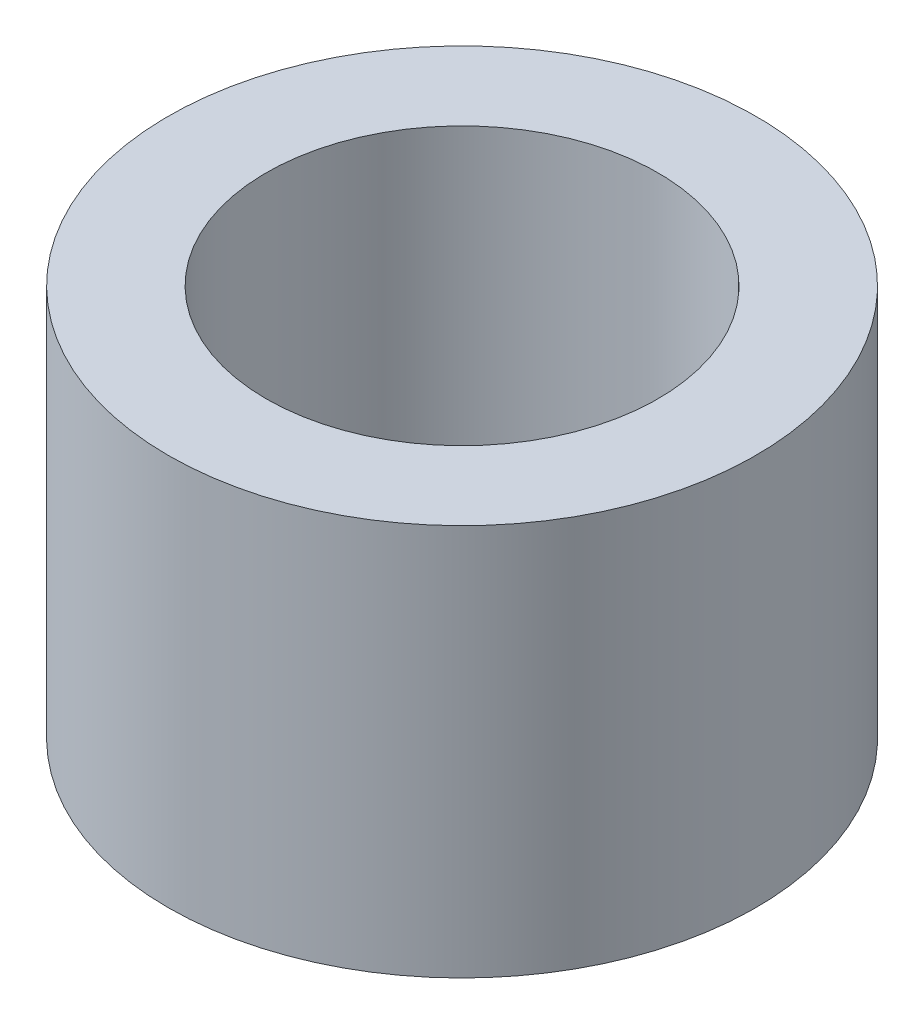
ISO-10303-21;
HEADER;
FILE_DESCRIPTION(('STEP AP214'),'2;1');
FILE_NAME('part.step','',(''),(''),'','','');
FILE_SCHEMA(('AUTOMOTIVE_DESIGN { 1 0 10303 214 1 1 1 1 }'));
ENDSEC;
DATA;
#1=APPLICATION_CONTEXT('core data for automotive mechanical design processes');
#2=APPLICATION_PROTOCOL_DEFINITION('international standard','automotive_design',2000,#1);
#3=PRODUCT_CONTEXT('',#1,'mechanical');
#4=PRODUCT('Part','Part','',(#3));
#5=PRODUCT_RELATED_PRODUCT_CATEGORY('part','',(#4));
#6=PRODUCT_DEFINITION_FORMATION('','',#4);
#7=PRODUCT_DEFINITION_CONTEXT('part definition',#1,'design');
#8=PRODUCT_DEFINITION('design','',#6,#7);
#9=PRODUCT_DEFINITION_SHAPE('','',#8);
#10=(LENGTH_UNIT() NAMED_UNIT(*) SI_UNIT(.MILLI.,.METRE.));
#11=(NAMED_UNIT(*) PLANE_ANGLE_UNIT() SI_UNIT($,.RADIAN.));
#12=(NAMED_UNIT(*) SI_UNIT($,.STERADIAN.) SOLID_ANGLE_UNIT());
#13=UNCERTAINTY_MEASURE_WITH_UNIT(LENGTH_MEASURE(1.E-05),#10,'distance_accuracy_value','');
#14=(GEOMETRIC_REPRESENTATION_CONTEXT(3) GLOBAL_UNCERTAINTY_ASSIGNED_CONTEXT((#13)) GLOBAL_UNIT_ASSIGNED_CONTEXT((#10,
#11,#12)) REPRESENTATION_CONTEXT('',''));
#15=CARTESIAN_POINT('',(0.,0.,0.));
#16=DIRECTION('',(0.,0.,1.));
#17=DIRECTION('',(1.,0.,0.));
#18=AXIS2_PLACEMENT_3D('',#15,#16,#17);
#19=CARTESIAN_POINT('',(0.,3.2,0.));
#20=DIRECTION('',(0.,1.,0.));
#21=DIRECTION('',(0.,0.,1.));
#22=AXIS2_PLACEMENT_3D('',#19,#20,#21);
#23=PLANE('',#22);
#24=CARTESIAN_POINT('',(0.,3.2,0.));
#25=DIRECTION('',(0.,1.,0.));
#26=DIRECTION('',(0.,0.,1.));
#27=AXIS2_PLACEMENT_3D('',#24,#25,#26);
#28=CIRCLE('',#27,2.4);
#29=CARTESIAN_POINT('',(0.,3.2,2.4));
#30=VERTEX_POINT('',#29);
#31=EDGE_CURVE('E12',#30,#30,#28,.T.);
#32=ORIENTED_EDGE('',*,*,#31,.T.);
#33=EDGE_LOOP('',(#32));
#34=FACE_BOUND('',#33,.T.);
#35=CARTESIAN_POINT('',(0.,3.2,0.));
#36=DIRECTION('',(0.,1.,0.));
#37=DIRECTION('',(0.,0.,1.));
#38=AXIS2_PLACEMENT_3D('',#35,#36,#37);
#39=CIRCLE('',#38,1.6);
#40=CARTESIAN_POINT('',(0.,3.2,1.6));
#41=VERTEX_POINT('',#40);
#42=EDGE_CURVE('E53',#41,#41,#39,.T.);
#43=ORIENTED_EDGE('',*,*,#42,.F.);
#44=EDGE_LOOP('',(#43));
#45=FACE_BOUND('',#44,.T.);
#46=ADVANCED_FACE('F42',(#34,#45),#23,.T.);
#47=CARTESIAN_POINT('',(0.,0.,0.));
#48=DIRECTION('',(0.,1.,0.));
#49=DIRECTION('',(0.,0.,1.));
#50=AXIS2_PLACEMENT_3D('',#47,#48,#49);
#51=PLANE('',#50);
#52=CARTESIAN_POINT('',(0.,0.,0.));
#53=DIRECTION('',(0.,1.,0.));
#54=DIRECTION('',(0.,0.,1.));
#55=AXIS2_PLACEMENT_3D('',#52,#53,#54);
#56=CIRCLE('',#55,2.4);
#57=CARTESIAN_POINT('',(0.,0.,2.4));
#58=VERTEX_POINT('',#57);
#59=EDGE_CURVE('E46',#58,#58,#56,.T.);
#60=ORIENTED_EDGE('',*,*,#59,.F.);
#61=EDGE_LOOP('',(#60));
#62=FACE_BOUND('',#61,.T.);
#63=CARTESIAN_POINT('',(0.,0.,0.));
#64=DIRECTION('',(0.,1.,0.));
#65=DIRECTION('',(0.,0.,1.));
#66=AXIS2_PLACEMENT_3D('',#63,#64,#65);
#67=CIRCLE('',#66,1.6);
#68=CARTESIAN_POINT('',(0.,0.,1.6));
#69=VERTEX_POINT('',#68);
#70=EDGE_CURVE('E55',#69,#69,#67,.T.);
#71=ORIENTED_EDGE('',*,*,#70,.T.);
#72=EDGE_LOOP('',(#71));
#73=FACE_BOUND('',#72,.T.);
#74=ADVANCED_FACE('F65',(#62,#73),#51,.F.);
#75=CARTESIAN_POINT('',(0.,3.2,0.));
#76=DIRECTION('',(0.,-1.,0.));
#77=DIRECTION('',(0.,0.,-1.));
#78=AXIS2_PLACEMENT_3D('',#75,#76,#77);
#79=CYLINDRICAL_SURFACE('',#78,2.4);
#80=ORIENTED_EDGE('',*,*,#31,.F.);
#81=EDGE_LOOP('',(#80));
#82=FACE_BOUND('',#81,.T.);
#83=ORIENTED_EDGE('',*,*,#59,.T.);
#84=EDGE_LOOP('',(#83));
#85=FACE_BOUND('',#84,.T.);
#86=ADVANCED_FACE('F44',(#82,#85),#79,.T.);
#87=CARTESIAN_POINT('',(0.,3.2,0.));
#88=DIRECTION('',(0.,-1.,0.));
#89=DIRECTION('',(0.,0.,-1.));
#90=AXIS2_PLACEMENT_3D('',#87,#88,#89);
#91=CYLINDRICAL_SURFACE('',#90,1.6);
#92=ORIENTED_EDGE('',*,*,#42,.T.);
#93=EDGE_LOOP('',(#92));
#94=FACE_BOUND('',#93,.T.);
#95=ORIENTED_EDGE('',*,*,#70,.F.);
#96=EDGE_LOOP('',(#95));
#97=FACE_BOUND('',#96,.T.);
#98=ADVANCED_FACE('F61',(#94,#97),#91,.F.);
#99=CLOSED_SHELL('',(#46,#74,#86,#98));
#100=MANIFOLD_SOLID_BREP('B2',#99);
#101=ADVANCED_BREP_SHAPE_REPRESENTATION('',(#18,#100),#14);
#102=SHAPE_DEFINITION_REPRESENTATION(#9,#101);
ENDSEC;
END-ISO-10303-21;
